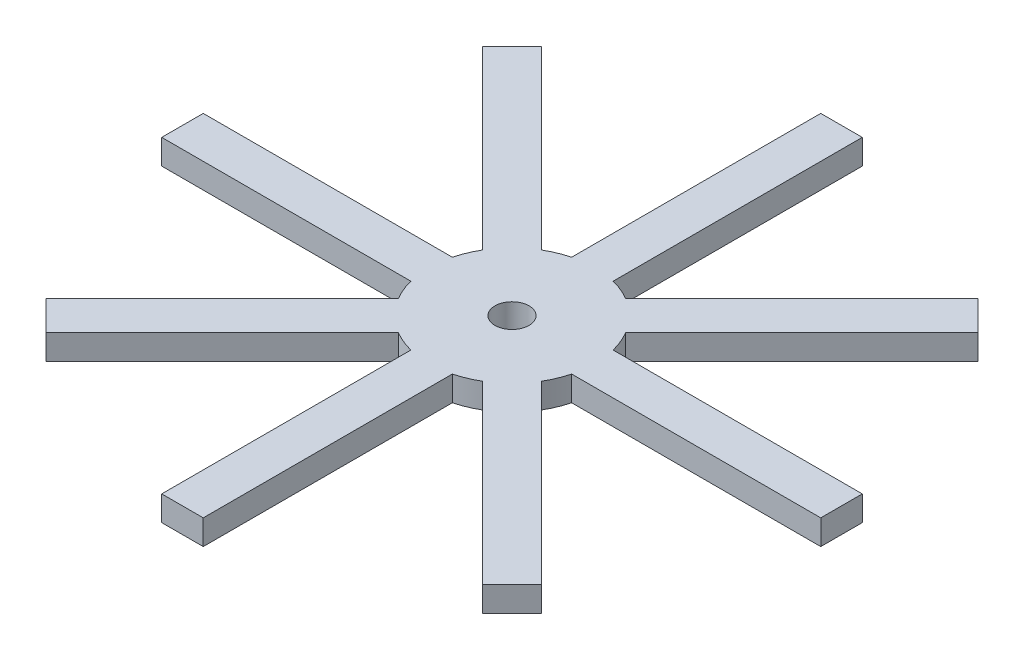
ISO-10303-21;
HEADER;
FILE_DESCRIPTION(('STEP AP214'),'2;1');
FILE_NAME('part.step','',(''),(''),'','','');
FILE_SCHEMA(('AUTOMOTIVE_DESIGN { 1 0 10303 214 1 1 1 1 }'));
ENDSEC;
DATA;
#1=APPLICATION_CONTEXT('core data for automotive mechanical design processes');
#2=APPLICATION_PROTOCOL_DEFINITION('international standard','automotive_design',2000,#1);
#3=PRODUCT_CONTEXT('',#1,'mechanical');
#4=PRODUCT('Part','Part','',(#3));
#5=PRODUCT_RELATED_PRODUCT_CATEGORY('part','',(#4));
#6=PRODUCT_DEFINITION_FORMATION('','',#4);
#7=PRODUCT_DEFINITION_CONTEXT('part definition',#1,'design');
#8=PRODUCT_DEFINITION('design','',#6,#7);
#9=PRODUCT_DEFINITION_SHAPE('','',#8);
#10=(LENGTH_UNIT() NAMED_UNIT(*) SI_UNIT(.MILLI.,.METRE.));
#11=(NAMED_UNIT(*) PLANE_ANGLE_UNIT() SI_UNIT($,.RADIAN.));
#12=(NAMED_UNIT(*) SI_UNIT($,.STERADIAN.) SOLID_ANGLE_UNIT());
#13=UNCERTAINTY_MEASURE_WITH_UNIT(LENGTH_MEASURE(1.E-05),#10,'distance_accuracy_value','');
#14=(GEOMETRIC_REPRESENTATION_CONTEXT(3) GLOBAL_UNCERTAINTY_ASSIGNED_CONTEXT((#13)) GLOBAL_UNIT_ASSIGNED_CONTEXT((#10,
#11,#12)) REPRESENTATION_CONTEXT('',''));
#15=CARTESIAN_POINT('',(0.,0.,0.));
#16=DIRECTION('',(0.,0.,1.));
#17=DIRECTION('',(1.,0.,0.));
#18=AXIS2_PLACEMENT_3D('',#15,#16,#17);
#19=CARTESIAN_POINT('',(0.,6.,0.));
#20=DIRECTION('',(0.,-1.,0.));
#21=DIRECTION('',(0.,0.,-1.));
#22=AXIS2_PLACEMENT_3D('',#19,#20,#21);
#23=CYLINDRICAL_SURFACE('',#22,20.);
#24=CARTESIAN_POINT('',(0.,6.,0.));
#25=DIRECTION('',(0.,1.,0.));
#26=DIRECTION('',(0.,0.,1.));
#27=AXIS2_PLACEMENT_3D('',#24,#25,#26);
#28=CIRCLE('',#27,20.);
#29=CARTESIAN_POINT('',(-17.2285978435618,6.,-10.1575300316966));
#30=VERTEX_POINT('',#29);
#31=CARTESIAN_POINT('',(-19.364916731037,6.,-5.00000000000021));
#32=VERTEX_POINT('',#31);
#33=EDGE_CURVE('E43',#30,#32,#28,.T.);
#34=ORIENTED_EDGE('',*,*,#33,.F.);
#35=DIRECTION('',(0.,1.,0.));
#36=VECTOR('',#35,1.);
#37=CARTESIAN_POINT('',(-17.2285978435618,0.,-10.1575300316966));
#38=LINE('',#37,#36);
#39=CARTESIAN_POINT('',(-17.2285978435618,0.,-10.1575300316966));
#40=VERTEX_POINT('',#39);
#41=EDGE_CURVE('E248',#40,#30,#38,.T.);
#42=ORIENTED_EDGE('',*,*,#41,.F.);
#43=CARTESIAN_POINT('',(0.,0.,0.));
#44=DIRECTION('',(0.,1.,0.));
#45=DIRECTION('',(0.,0.,1.));
#46=AXIS2_PLACEMENT_3D('',#43,#44,#45);
#47=CIRCLE('',#46,20.);
#48=CARTESIAN_POINT('',(-19.364916731037,0.,-5.00000000000021));
#49=VERTEX_POINT('',#48);
#50=EDGE_CURVE('E260',#40,#49,#47,.T.);
#51=ORIENTED_EDGE('',*,*,#50,.T.);
#52=DIRECTION('',(0.,1.,0.));
#53=VECTOR('',#52,1.);
#54=CARTESIAN_POINT('',(-19.364916731037,0.,-5.00000000000021));
#55=LINE('',#54,#53);
#56=EDGE_CURVE('E470',#49,#32,#55,.T.);
#57=ORIENTED_EDGE('',*,*,#56,.T.);
#58=EDGE_LOOP('',(#34,#42,#51,#57));
#59=FACE_BOUND('',#58,.T.);
#60=ADVANCED_FACE('F34',(#59),#23,.T.);
#61=CARTESIAN_POINT('',(-19.3649167310371,6.,4.9999999999998));
#62=VERTEX_POINT('',#61);
#63=CARTESIAN_POINT('',(-17.228597843562,6.,10.1575300316963));
#64=VERTEX_POINT('',#63);
#65=EDGE_CURVE('E585',#62,#64,#28,.T.);
#66=ORIENTED_EDGE('',*,*,#65,.F.);
#67=DIRECTION('',(0.,1.,0.));
#68=VECTOR('',#67,1.);
#69=CARTESIAN_POINT('',(-19.3649167310371,0.,4.9999999999998));
#70=LINE('',#69,#68);
#71=CARTESIAN_POINT('',(-19.3649167310371,0.,4.9999999999998));
#72=VERTEX_POINT('',#71);
#73=EDGE_CURVE('E468',#72,#62,#70,.T.);
#74=ORIENTED_EDGE('',*,*,#73,.F.);
#75=CARTESIAN_POINT('',(-17.228597843562,0.,10.1575300316963));
#76=VERTEX_POINT('',#75);
#77=EDGE_CURVE('E271',#72,#76,#47,.T.);
#78=ORIENTED_EDGE('',*,*,#77,.T.);
#79=DIRECTION('',(0.,1.,0.));
#80=VECTOR('',#79,1.);
#81=CARTESIAN_POINT('',(-17.228597843562,0.,10.1575300316963));
#82=LINE('',#81,#80);
#83=EDGE_CURVE('E446',#76,#64,#82,.T.);
#84=ORIENTED_EDGE('',*,*,#83,.T.);
#85=EDGE_LOOP('',(#66,#74,#78,#84));
#86=FACE_BOUND('',#85,.T.);
#87=ADVANCED_FACE('F608',(#86),#23,.T.);
#88=CARTESIAN_POINT('',(-10.1575300316966,6.,17.2285978435618));
#89=VERTEX_POINT('',#88);
#90=CARTESIAN_POINT('',(-5.00000000000014,6.,19.364916731037));
#91=VERTEX_POINT('',#90);
#92=EDGE_CURVE('E586',#89,#91,#28,.T.);
#93=ORIENTED_EDGE('',*,*,#92,.F.);
#94=DIRECTION('',(0.,1.,0.));
#95=VECTOR('',#94,1.);
#96=CARTESIAN_POINT('',(-10.1575300316966,0.,17.2285978435618));
#97=LINE('',#96,#95);
#98=CARTESIAN_POINT('',(-10.1575300316966,0.,17.2285978435618));
#99=VERTEX_POINT('',#98);
#100=EDGE_CURVE('E443',#99,#89,#97,.T.);
#101=ORIENTED_EDGE('',*,*,#100,.F.);
#102=CARTESIAN_POINT('',(-5.00000000000014,0.,19.364916731037));
#103=VERTEX_POINT('',#102);
#104=EDGE_CURVE('E274',#99,#103,#47,.T.);
#105=ORIENTED_EDGE('',*,*,#104,.T.);
#106=DIRECTION('',(0.,1.,0.));
#107=VECTOR('',#106,1.);
#108=CARTESIAN_POINT('',(-5.00000000000014,0.,19.364916731037));
#109=LINE('',#108,#107);
#110=EDGE_CURVE('E421',#103,#91,#109,.T.);
#111=ORIENTED_EDGE('',*,*,#110,.T.);
#112=EDGE_LOOP('',(#93,#101,#105,#111));
#113=FACE_BOUND('',#112,.T.);
#114=ADVANCED_FACE('F612',(#113),#23,.T.);
#115=CARTESIAN_POINT('',(4.99999999999987,6.,19.3649167310371));
#116=VERTEX_POINT('',#115);
#117=CARTESIAN_POINT('',(10.1575300316963,6.,17.2285978435619));
#118=VERTEX_POINT('',#117);
#119=EDGE_CURVE('E588',#116,#118,#28,.T.);
#120=ORIENTED_EDGE('',*,*,#119,.F.);
#121=DIRECTION('',(0.,1.,0.));
#122=VECTOR('',#121,1.);
#123=CARTESIAN_POINT('',(4.99999999999987,0.,19.3649167310371));
#124=LINE('',#123,#122);
#125=CARTESIAN_POINT('',(4.99999999999987,0.,19.3649167310371));
#126=VERTEX_POINT('',#125);
#127=EDGE_CURVE('E418',#126,#116,#124,.T.);
#128=ORIENTED_EDGE('',*,*,#127,.F.);
#129=CARTESIAN_POINT('',(10.1575300316963,0.,17.2285978435619));
#130=VERTEX_POINT('',#129);
#131=EDGE_CURVE('E280',#126,#130,#47,.T.);
#132=ORIENTED_EDGE('',*,*,#131,.T.);
#133=DIRECTION('',(0.,1.,0.));
#134=VECTOR('',#133,1.);
#135=CARTESIAN_POINT('',(10.1575300316963,0.,17.2285978435619));
#136=LINE('',#135,#134);
#137=EDGE_CURVE('E396',#130,#118,#136,.T.);
#138=ORIENTED_EDGE('',*,*,#137,.T.);
#139=EDGE_LOOP('',(#120,#128,#132,#138));
#140=FACE_BOUND('',#139,.T.);
#141=ADVANCED_FACE('F616',(#140),#23,.T.);
#142=CARTESIAN_POINT('',(17.2285978435619,6.,10.1575300316965));
#143=VERTEX_POINT('',#142);
#144=CARTESIAN_POINT('',(19.3649167310371,6.,5.00000000000008));
#145=VERTEX_POINT('',#144);
#146=EDGE_CURVE('E590',#143,#145,#28,.T.);
#147=ORIENTED_EDGE('',*,*,#146,.F.);
#148=DIRECTION('',(0.,1.,0.));
#149=VECTOR('',#148,1.);
#150=CARTESIAN_POINT('',(17.2285978435618,0.,10.1575300316965));
#151=LINE('',#150,#149);
#152=CARTESIAN_POINT('',(17.2285978435618,0.,10.1575300316965));
#153=VERTEX_POINT('',#152);
#154=EDGE_CURVE('E393',#153,#143,#151,.T.);
#155=ORIENTED_EDGE('',*,*,#154,.F.);
#156=CARTESIAN_POINT('',(19.3649167310371,0.,5.00000000000008));
#157=VERTEX_POINT('',#156);
#158=EDGE_CURVE('E286',#153,#157,#47,.T.);
#159=ORIENTED_EDGE('',*,*,#158,.T.);
#160=DIRECTION('',(0.,1.,0.));
#161=VECTOR('',#160,1.);
#162=CARTESIAN_POINT('',(19.3649167310371,0.,5.00000000000008));
#163=LINE('',#162,#161);
#164=EDGE_CURVE('E371',#157,#145,#163,.T.);
#165=ORIENTED_EDGE('',*,*,#164,.T.);
#166=EDGE_LOOP('',(#147,#155,#159,#165));
#167=FACE_BOUND('',#166,.T.);
#168=ADVANCED_FACE('F604',(#167),#23,.T.);
#169=CARTESIAN_POINT('',(19.3649167310371,6.,-4.99999999999993));
#170=VERTEX_POINT('',#169);
#171=CARTESIAN_POINT('',(17.2285978435619,6.,-10.1575300316964));
#172=VERTEX_POINT('',#171);
#173=EDGE_CURVE('E592',#170,#172,#28,.T.);
#174=ORIENTED_EDGE('',*,*,#173,.F.);
#175=DIRECTION('',(0.,1.,0.));
#176=VECTOR('',#175,1.);
#177=CARTESIAN_POINT('',(19.3649167310371,0.,-4.99999999999994));
#178=LINE('',#177,#176);
#179=CARTESIAN_POINT('',(19.3649167310371,0.,-4.99999999999994));
#180=VERTEX_POINT('',#179);
#181=EDGE_CURVE('E368',#180,#170,#178,.T.);
#182=ORIENTED_EDGE('',*,*,#181,.F.);
#183=CARTESIAN_POINT('',(17.2285978435619,0.,-10.1575300316964));
#184=VERTEX_POINT('',#183);
#185=EDGE_CURVE('E292',#180,#184,#47,.T.);
#186=ORIENTED_EDGE('',*,*,#185,.T.);
#187=DIRECTION('',(0.,1.,0.));
#188=VECTOR('',#187,1.);
#189=CARTESIAN_POINT('',(17.2285978435619,0.,-10.1575300316964));
#190=LINE('',#189,#188);
#191=EDGE_CURVE('E346',#184,#172,#190,.T.);
#192=ORIENTED_EDGE('',*,*,#191,.T.);
#193=EDGE_LOOP('',(#174,#182,#186,#192));
#194=FACE_BOUND('',#193,.T.);
#195=ADVANCED_FACE('F598',(#194),#23,.T.);
#196=CARTESIAN_POINT('',(10.1575300316965,6.,-17.2285978435619));
#197=VERTEX_POINT('',#196);
#198=CARTESIAN_POINT('',(5.00000000000001,6.,-19.3649167310371));
#199=VERTEX_POINT('',#198);
#200=EDGE_CURVE('E44',#197,#199,#28,.T.);
#201=ORIENTED_EDGE('',*,*,#200,.F.);
#202=DIRECTION('',(0.,1.,0.));
#203=VECTOR('',#202,1.);
#204=CARTESIAN_POINT('',(10.1575300316964,0.,-17.2285978435619));
#205=LINE('',#204,#203);
#206=CARTESIAN_POINT('',(10.1575300316964,0.,-17.2285978435619));
#207=VERTEX_POINT('',#206);
#208=EDGE_CURVE('E343',#207,#197,#205,.T.);
#209=ORIENTED_EDGE('',*,*,#208,.F.);
#210=CARTESIAN_POINT('',(5.00000000000001,0.,-19.3649167310371));
#211=VERTEX_POINT('',#210);
#212=EDGE_CURVE('E273',#207,#211,#47,.T.);
#213=ORIENTED_EDGE('',*,*,#212,.T.);
#214=DIRECTION('',(0.,1.,0.));
#215=VECTOR('',#214,1.);
#216=CARTESIAN_POINT('',(5.00000000000001,0.,-19.3649167310371));
#217=LINE('',#216,#215);
#218=EDGE_CURVE('E321',#211,#199,#217,.T.);
#219=ORIENTED_EDGE('',*,*,#218,.T.);
#220=EDGE_LOOP('',(#201,#209,#213,#219));
#221=FACE_BOUND('',#220,.T.);
#222=ADVANCED_FACE('F596',(#221),#23,.T.);
#223=CARTESIAN_POINT('',(0.,6.,0.));
#224=DIRECTION('',(0.,1.,0.));
#225=DIRECTION('',(0.,0.,1.));
#226=AXIS2_PLACEMENT_3D('',#223,#224,#225);
#227=PLANE('',#226);
#228=CARTESIAN_POINT('',(-5.,6.,-19.3649167310371));
#229=VERTEX_POINT('',#228);
#230=CARTESIAN_POINT('',(-10.1575300316962,6.,-17.228597843562));
#231=VERTEX_POINT('',#230);
#232=EDGE_CURVE('E11',#229,#231,#28,.T.);
#233=ORIENTED_EDGE('',*,*,#232,.T.);
#234=DIRECTION('',(-0.707106781186539,0.,-0.707106781186556));
#235=VECTOR('',#234,1.);
#236=CARTESIAN_POINT('',(-52.5839369028885,6.,-59.6550047147554));
#237=LINE('',#236,#235);
#238=CARTESIAN_POINT('',(-52.5839369028885,6.,-59.6550047147554));
#239=VERTEX_POINT('',#238);
#240=EDGE_CURVE('E493',#231,#239,#237,.T.);
#241=ORIENTED_EDGE('',*,*,#240,.T.);
#242=DIRECTION('',(-0.707106781186556,0.,0.707106781186539));
#243=VECTOR('',#242,1.);
#244=CARTESIAN_POINT('',(-59.6550047147541,6.,-52.58393690289));
#245=LINE('',#244,#243);
#246=CARTESIAN_POINT('',(-59.6550047147541,6.,-52.58393690289));
#247=VERTEX_POINT('',#246);
#248=EDGE_CURVE('E256',#239,#247,#245,.T.);
#249=ORIENTED_EDGE('',*,*,#248,.T.);
#250=DIRECTION('',(0.707106781186539,0.,0.707106781186556));
#251=VECTOR('',#250,1.);
#252=CARTESIAN_POINT('',(-59.6550047147541,6.,-52.58393690289));
#253=LINE('',#252,#251);
#254=EDGE_CURVE('E51',#247,#30,#253,.T.);
#255=ORIENTED_EDGE('',*,*,#254,.T.);
#256=ORIENTED_EDGE('',*,*,#33,.T.);
#257=DIRECTION('',(-1.,0.,0.));
#258=VECTOR('',#257,1.);
#259=CARTESIAN_POINT('',(-79.364916731037,6.,-5.00000000000083));
#260=LINE('',#259,#258);
#261=CARTESIAN_POINT('',(-79.364916731037,6.,-5.00000000000083));
#262=VERTEX_POINT('',#261);
#263=EDGE_CURVE('E479',#32,#262,#260,.T.);
#264=ORIENTED_EDGE('',*,*,#263,.T.);
#265=DIRECTION('',(0.,0.,1.));
#266=VECTOR('',#265,1.);
#267=CARTESIAN_POINT('',(-79.3649167310371,6.,4.99999999999917));
#268=LINE('',#267,#266);
#269=CARTESIAN_POINT('',(-79.3649167310371,6.,4.99999999999917));
#270=VERTEX_POINT('',#269);
#271=EDGE_CURVE('E476',#262,#270,#268,.T.);
#272=ORIENTED_EDGE('',*,*,#271,.T.);
#273=DIRECTION('',(1.,0.,0.));
#274=VECTOR('',#273,1.);
#275=CARTESIAN_POINT('',(-79.3649167310371,6.,4.99999999999917));
#276=LINE('',#275,#274);
#277=EDGE_CURVE('E58',#270,#62,#276,.T.);
#278=ORIENTED_EDGE('',*,*,#277,.T.);
#279=ORIENTED_EDGE('',*,*,#65,.T.);
#280=DIRECTION('',(-0.707106781186554,0.,0.707106781186541));
#281=VECTOR('',#280,1.);
#282=CARTESIAN_POINT('',(-59.6550047147552,6.,52.5839369028887));
#283=LINE('',#282,#281);
#284=CARTESIAN_POINT('',(-59.6550047147552,6.,52.5839369028887));
#285=VERTEX_POINT('',#284);
#286=EDGE_CURVE('E456',#64,#285,#283,.T.);
#287=ORIENTED_EDGE('',*,*,#286,.T.);
#288=DIRECTION('',(0.707106781186541,0.,0.707106781186554));
#289=VECTOR('',#288,1.);
#290=CARTESIAN_POINT('',(-52.5839369028898,6.,59.6550047147543));
#291=LINE('',#290,#289);
#292=CARTESIAN_POINT('',(-52.5839369028898,6.,59.6550047147543));
#293=VERTEX_POINT('',#292);
#294=EDGE_CURVE('E452',#285,#293,#291,.T.);
#295=ORIENTED_EDGE('',*,*,#294,.T.);
#296=DIRECTION('',(0.707106781186554,0.,-0.707106781186541));
#297=VECTOR('',#296,1.);
#298=CARTESIAN_POINT('',(-52.5839369028898,6.,59.6550047147543));
#299=LINE('',#298,#297);
#300=EDGE_CURVE('E459',#293,#89,#299,.T.);
#301=ORIENTED_EDGE('',*,*,#300,.T.);
#302=ORIENTED_EDGE('',*,*,#92,.T.);
#303=DIRECTION('',(0.,0.,1.));
#304=VECTOR('',#303,1.);
#305=CARTESIAN_POINT('',(-5.00000000000055,6.,79.364916731037));
#306=LINE('',#305,#304);
#307=CARTESIAN_POINT('',(-5.00000000000055,6.,79.364916731037));
#308=VERTEX_POINT('',#307);
#309=EDGE_CURVE('E431',#91,#308,#306,.T.);
#310=ORIENTED_EDGE('',*,*,#309,.T.);
#311=DIRECTION('',(1.,0.,0.));
#312=VECTOR('',#311,1.);
#313=CARTESIAN_POINT('',(4.99999999999945,6.,79.3649167310371));
#314=LINE('',#313,#312);
#315=CARTESIAN_POINT('',(4.99999999999945,6.,79.3649167310371));
#316=VERTEX_POINT('',#315);
#317=EDGE_CURVE('E427',#308,#316,#314,.T.);
#318=ORIENTED_EDGE('',*,*,#317,.T.);
#319=DIRECTION('',(0.,0.,-1.));
#320=VECTOR('',#319,1.);
#321=CARTESIAN_POINT('',(4.99999999999945,6.,79.3649167310371));
#322=LINE('',#321,#320);
#323=EDGE_CURVE('E434',#316,#116,#322,.T.);
#324=ORIENTED_EDGE('',*,*,#323,.T.);
#325=ORIENTED_EDGE('',*,*,#119,.T.);
#326=DIRECTION('',(0.707106781186544,0.,0.707106781186551));
#327=VECTOR('',#326,1.);
#328=CARTESIAN_POINT('',(52.5839369028889,6.,59.655004714755));
#329=LINE('',#328,#327);
#330=CARTESIAN_POINT('',(52.5839369028889,6.,59.655004714755));
#331=VERTEX_POINT('',#330);
#332=EDGE_CURVE('E406',#118,#331,#329,.T.);
#333=ORIENTED_EDGE('',*,*,#332,.T.);
#334=DIRECTION('',(0.707106781186552,0.,-0.707106781186543));
#335=VECTOR('',#334,1.);
#336=CARTESIAN_POINT('',(59.6550047147545,6.,52.5839369028896));
#337=LINE('',#336,#335);
#338=CARTESIAN_POINT('',(59.6550047147545,6.,52.5839369028896));
#339=VERTEX_POINT('',#338);
#340=EDGE_CURVE('E402',#331,#339,#337,.T.);
#341=ORIENTED_EDGE('',*,*,#340,.T.);
#342=DIRECTION('',(-0.707106781186544,0.,-0.707106781186551));
#343=VECTOR('',#342,1.);
#344=CARTESIAN_POINT('',(59.6550047147545,6.,52.5839369028896));
#345=LINE('',#344,#343);
#346=EDGE_CURVE('E409',#339,#143,#345,.T.);
#347=ORIENTED_EDGE('',*,*,#346,.T.);
#348=ORIENTED_EDGE('',*,*,#146,.T.);
#349=DIRECTION('',(1.,0.,0.));
#350=VECTOR('',#349,1.);
#351=CARTESIAN_POINT('',(79.3649167310371,6.,5.00000000000028));
#352=LINE('',#351,#350);
#353=CARTESIAN_POINT('',(79.3649167310371,6.,5.00000000000028));
#354=VERTEX_POINT('',#353);
#355=EDGE_CURVE('E381',#145,#354,#352,.T.);
#356=ORIENTED_EDGE('',*,*,#355,.T.);
#357=DIRECTION('',(0.,0.,-1.));
#358=VECTOR('',#357,1.);
#359=CARTESIAN_POINT('',(79.3649167310371,6.,-4.99999999999972));
#360=LINE('',#359,#358);
#361=CARTESIAN_POINT('',(79.3649167310371,6.,-4.99999999999972));
#362=VERTEX_POINT('',#361);
#363=EDGE_CURVE('E377',#354,#362,#360,.T.);
#364=ORIENTED_EDGE('',*,*,#363,.T.);
#365=DIRECTION('',(-1.,0.,0.));
#366=VECTOR('',#365,1.);
#367=CARTESIAN_POINT('',(79.3649167310371,6.,-4.99999999999972));
#368=LINE('',#367,#366);
#369=EDGE_CURVE('E384',#362,#170,#368,.T.);
#370=ORIENTED_EDGE('',*,*,#369,.T.);
#371=ORIENTED_EDGE('',*,*,#173,.T.);
#372=DIRECTION('',(0.707106781186549,0.,-0.707106781186546));
#373=VECTOR('',#372,1.);
#374=CARTESIAN_POINT('',(59.6550047147548,6.,-52.5839369028892));
#375=LINE('',#374,#373);
#376=CARTESIAN_POINT('',(59.6550047147548,6.,-52.5839369028892));
#377=VERTEX_POINT('',#376);
#378=EDGE_CURVE('E356',#172,#377,#375,.T.);
#379=ORIENTED_EDGE('',*,*,#378,.T.);
#380=DIRECTION('',(-0.707106781186546,0.,-0.707106781186549));
#381=VECTOR('',#380,1.);
#382=CARTESIAN_POINT('',(52.5839369028894,6.,-59.6550047147546));
#383=LINE('',#382,#381);
#384=CARTESIAN_POINT('',(52.5839369028894,6.,-59.6550047147546));
#385=VERTEX_POINT('',#384);
#386=EDGE_CURVE('E352',#377,#385,#383,.T.);
#387=ORIENTED_EDGE('',*,*,#386,.T.);
#388=DIRECTION('',(-0.707106781186549,0.,0.707106781186546));
#389=VECTOR('',#388,1.);
#390=CARTESIAN_POINT('',(52.5839369028894,6.,-59.6550047147546));
#391=LINE('',#390,#389);
#392=EDGE_CURVE('E359',#385,#197,#391,.T.);
#393=ORIENTED_EDGE('',*,*,#392,.T.);
#394=ORIENTED_EDGE('',*,*,#200,.T.);
#395=DIRECTION('',(0.,0.,-1.));
#396=VECTOR('',#395,1.);
#397=CARTESIAN_POINT('',(5.,6.,-79.3649167310371));
#398=LINE('',#397,#396);
#399=CARTESIAN_POINT('',(5.,6.,-79.3649167310371));
#400=VERTEX_POINT('',#399);
#401=EDGE_CURVE('E331',#199,#400,#398,.T.);
#402=ORIENTED_EDGE('',*,*,#401,.T.);
#403=DIRECTION('',(-1.,0.,0.));
#404=VECTOR('',#403,1.);
#405=CARTESIAN_POINT('',(-5.,6.,-79.3649167310371));
#406=LINE('',#405,#404);
#407=CARTESIAN_POINT('',(-5.,6.,-79.3649167310371));
#408=VERTEX_POINT('',#407);
#409=EDGE_CURVE('E327',#400,#408,#406,.T.);
#410=ORIENTED_EDGE('',*,*,#409,.T.);
#411=DIRECTION('',(0.,0.,1.));
#412=VECTOR('',#411,1.);
#413=CARTESIAN_POINT('',(-5.,6.,-79.3649167310371));
#414=LINE('',#413,#412);
#415=EDGE_CURVE('E334',#408,#229,#414,.T.);
#416=ORIENTED_EDGE('',*,*,#415,.T.);
#417=EDGE_LOOP('',(#233,#241,#249,#255,#256,#264,#272,#278,#279,#287,#295,#301,#302,#310,#318,
#324,#325,#333,#341,#347,#348,#356,#364,#370,#371,#379,#387,#393,#394,#402,#410,#416));
#418=FACE_BOUND('',#417,.T.);
#419=CARTESIAN_POINT('',(0.,6.,0.));
#420=DIRECTION('',(0.,1.,0.));
#421=DIRECTION('',(0.,0.,1.));
#422=AXIS2_PLACEMENT_3D('',#419,#420,#421);
#423=CIRCLE('',#422,4.1);
#424=CARTESIAN_POINT('',(0.,6.,4.1));
#425=VERTEX_POINT('',#424);
#426=EDGE_CURVE('E303',#425,#425,#423,.T.);
#427=ORIENTED_EDGE('',*,*,#426,.F.);
#428=EDGE_LOOP('',(#427));
#429=FACE_BOUND('',#428,.T.);
#430=ADVANCED_FACE('F506',(#418,#429),#227,.T.);
#431=CARTESIAN_POINT('',(0.,0.,0.));
#432=DIRECTION('',(0.,1.,0.));
#433=DIRECTION('',(0.,0.,1.));
#434=AXIS2_PLACEMENT_3D('',#431,#432,#433);
#435=PLANE('',#434);
#436=ORIENTED_EDGE('',*,*,#50,.F.);
#437=DIRECTION('',(0.707106781186539,0.,0.707106781186556));
#438=VECTOR('',#437,1.);
#439=CARTESIAN_POINT('',(-59.6550047147541,0.,-52.58393690289));
#440=LINE('',#439,#438);
#441=CARTESIAN_POINT('',(-59.6550047147541,0.,-52.58393690289));
#442=VERTEX_POINT('',#441);
#443=EDGE_CURVE('E245',#442,#40,#440,.T.);
#444=ORIENTED_EDGE('',*,*,#443,.F.);
#445=DIRECTION('',(-0.707106781186556,0.,0.707106781186539));
#446=VECTOR('',#445,1.);
#447=CARTESIAN_POINT('',(-59.6550047147541,0.,-52.58393690289));
#448=LINE('',#447,#446);
#449=CARTESIAN_POINT('',(-52.5839369028885,0.,-59.6550047147554));
#450=VERTEX_POINT('',#449);
#451=EDGE_CURVE('E263',#450,#442,#448,.T.);
#452=ORIENTED_EDGE('',*,*,#451,.F.);
#453=DIRECTION('',(-0.707106781186539,0.,-0.707106781186556));
#454=VECTOR('',#453,1.);
#455=CARTESIAN_POINT('',(-52.5839369028885,0.,-59.6550047147554));
#456=LINE('',#455,#454);
#457=CARTESIAN_POINT('',(-10.1575300316962,0.,-17.228597843562));
#458=VERTEX_POINT('',#457);
#459=EDGE_CURVE('E255',#458,#450,#456,.T.);
#460=ORIENTED_EDGE('',*,*,#459,.F.);
#461=CARTESIAN_POINT('',(-5.00000000000001,0.,-19.3649167310371));
#462=VERTEX_POINT('',#461);
#463=EDGE_CURVE('E38',#462,#458,#47,.T.);
#464=ORIENTED_EDGE('',*,*,#463,.F.);
#465=DIRECTION('',(0.,0.,1.));
#466=VECTOR('',#465,1.);
#467=CARTESIAN_POINT('',(-5.,0.,-79.3649167310371));
#468=LINE('',#467,#466);
#469=CARTESIAN_POINT('',(-5.,0.,-79.3649167310371));
#470=VERTEX_POINT('',#469);
#471=EDGE_CURVE('E330',#470,#462,#468,.T.);
#472=ORIENTED_EDGE('',*,*,#471,.F.);
#473=DIRECTION('',(-1.,0.,0.));
#474=VECTOR('',#473,1.);
#475=CARTESIAN_POINT('',(-5.,0.,-79.3649167310371));
#476=LINE('',#475,#474);
#477=CARTESIAN_POINT('',(5.,0.,-79.3649167310371));
#478=VERTEX_POINT('',#477);
#479=EDGE_CURVE('E322',#478,#470,#476,.T.);
#480=ORIENTED_EDGE('',*,*,#479,.F.);
#481=DIRECTION('',(0.,0.,-1.));
#482=VECTOR('',#481,1.);
#483=CARTESIAN_POINT('',(5.,0.,-79.3649167310371));
#484=LINE('',#483,#482);
#485=EDGE_CURVE('E339',#211,#478,#484,.T.);
#486=ORIENTED_EDGE('',*,*,#485,.F.);
#487=ORIENTED_EDGE('',*,*,#212,.F.);
#488=DIRECTION('',(-0.707106781186549,0.,0.707106781186546));
#489=VECTOR('',#488,1.);
#490=CARTESIAN_POINT('',(52.5839369028894,0.,-59.6550047147546));
#491=LINE('',#490,#489);
#492=CARTESIAN_POINT('',(52.5839369028894,0.,-59.6550047147546));
#493=VERTEX_POINT('',#492);
#494=EDGE_CURVE('E355',#493,#207,#491,.T.);
#495=ORIENTED_EDGE('',*,*,#494,.F.);
#496=DIRECTION('',(-0.707106781186546,0.,-0.707106781186549));
#497=VECTOR('',#496,1.);
#498=CARTESIAN_POINT('',(52.5839369028894,0.,-59.6550047147546));
#499=LINE('',#498,#497);
#500=CARTESIAN_POINT('',(59.6550047147548,0.,-52.5839369028892));
#501=VERTEX_POINT('',#500);
#502=EDGE_CURVE('E347',#501,#493,#499,.T.);
#503=ORIENTED_EDGE('',*,*,#502,.F.);
#504=DIRECTION('',(0.707106781186549,0.,-0.707106781186546));
#505=VECTOR('',#504,1.);
#506=CARTESIAN_POINT('',(59.6550047147548,0.,-52.5839369028892));
#507=LINE('',#506,#505);
#508=EDGE_CURVE('E364',#184,#501,#507,.T.);
#509=ORIENTED_EDGE('',*,*,#508,.F.);
#510=ORIENTED_EDGE('',*,*,#185,.F.);
#511=DIRECTION('',(-1.,0.,0.));
#512=VECTOR('',#511,1.);
#513=CARTESIAN_POINT('',(79.3649167310371,0.,-4.99999999999972));
#514=LINE('',#513,#512);
#515=CARTESIAN_POINT('',(79.3649167310371,0.,-4.99999999999972));
#516=VERTEX_POINT('',#515);
#517=EDGE_CURVE('E380',#516,#180,#514,.T.);
#518=ORIENTED_EDGE('',*,*,#517,.F.);
#519=DIRECTION('',(0.,0.,-1.));
#520=VECTOR('',#519,1.);
#521=CARTESIAN_POINT('',(79.3649167310371,0.,-4.99999999999972));
#522=LINE('',#521,#520);
#523=CARTESIAN_POINT('',(79.3649167310371,0.,5.00000000000028));
#524=VERTEX_POINT('',#523);
#525=EDGE_CURVE('E372',#524,#516,#522,.T.);
#526=ORIENTED_EDGE('',*,*,#525,.F.);
#527=DIRECTION('',(1.,0.,0.));
#528=VECTOR('',#527,1.);
#529=CARTESIAN_POINT('',(79.3649167310371,0.,5.00000000000028));
#530=LINE('',#529,#528);
#531=EDGE_CURVE('E389',#157,#524,#530,.T.);
#532=ORIENTED_EDGE('',*,*,#531,.F.);
#533=ORIENTED_EDGE('',*,*,#158,.F.);
#534=DIRECTION('',(-0.707106781186544,0.,-0.707106781186551));
#535=VECTOR('',#534,1.);
#536=CARTESIAN_POINT('',(59.6550047147545,0.,52.5839369028896));
#537=LINE('',#536,#535);
#538=CARTESIAN_POINT('',(59.6550047147545,0.,52.5839369028896));
#539=VERTEX_POINT('',#538);
#540=EDGE_CURVE('E405',#539,#153,#537,.T.);
#541=ORIENTED_EDGE('',*,*,#540,.F.);
#542=DIRECTION('',(0.707106781186552,0.,-0.707106781186543));
#543=VECTOR('',#542,1.);
#544=CARTESIAN_POINT('',(59.6550047147545,0.,52.5839369028896));
#545=LINE('',#544,#543);
#546=CARTESIAN_POINT('',(52.5839369028889,0.,59.655004714755));
#547=VERTEX_POINT('',#546);
#548=EDGE_CURVE('E397',#547,#539,#545,.T.);
#549=ORIENTED_EDGE('',*,*,#548,.F.);
#550=DIRECTION('',(0.707106781186544,0.,0.707106781186551));
#551=VECTOR('',#550,1.);
#552=CARTESIAN_POINT('',(52.5839369028889,0.,59.655004714755));
#553=LINE('',#552,#551);
#554=EDGE_CURVE('E414',#130,#547,#553,.T.);
#555=ORIENTED_EDGE('',*,*,#554,.F.);
#556=ORIENTED_EDGE('',*,*,#131,.F.);
#557=DIRECTION('',(0.,0.,-1.));
#558=VECTOR('',#557,1.);
#559=CARTESIAN_POINT('',(4.99999999999945,0.,79.3649167310371));
#560=LINE('',#559,#558);
#561=CARTESIAN_POINT('',(4.99999999999945,0.,79.3649167310371));
#562=VERTEX_POINT('',#561);
#563=EDGE_CURVE('E430',#562,#126,#560,.T.);
#564=ORIENTED_EDGE('',*,*,#563,.F.);
#565=DIRECTION('',(1.,0.,0.));
#566=VECTOR('',#565,1.);
#567=CARTESIAN_POINT('',(4.99999999999945,0.,79.3649167310371));
#568=LINE('',#567,#566);
#569=CARTESIAN_POINT('',(-5.00000000000055,0.,79.364916731037));
#570=VERTEX_POINT('',#569);
#571=EDGE_CURVE('E422',#570,#562,#568,.T.);
#572=ORIENTED_EDGE('',*,*,#571,.F.);
#573=DIRECTION('',(0.,0.,1.));
#574=VECTOR('',#573,1.);
#575=CARTESIAN_POINT('',(-5.00000000000055,0.,79.364916731037));
#576=LINE('',#575,#574);
#577=EDGE_CURVE('E439',#103,#570,#576,.T.);
#578=ORIENTED_EDGE('',*,*,#577,.F.);
#579=ORIENTED_EDGE('',*,*,#104,.F.);
#580=DIRECTION('',(0.707106781186554,0.,-0.707106781186541));
#581=VECTOR('',#580,1.);
#582=CARTESIAN_POINT('',(-52.5839369028898,0.,59.6550047147543));
#583=LINE('',#582,#581);
#584=CARTESIAN_POINT('',(-52.5839369028898,0.,59.6550047147543));
#585=VERTEX_POINT('',#584);
#586=EDGE_CURVE('E455',#585,#99,#583,.T.);
#587=ORIENTED_EDGE('',*,*,#586,.F.);
#588=DIRECTION('',(0.707106781186541,0.,0.707106781186554));
#589=VECTOR('',#588,1.);
#590=CARTESIAN_POINT('',(-52.5839369028898,0.,59.6550047147543));
#591=LINE('',#590,#589);
#592=CARTESIAN_POINT('',(-59.6550047147552,0.,52.5839369028887));
#593=VERTEX_POINT('',#592);
#594=EDGE_CURVE('E447',#593,#585,#591,.T.);
#595=ORIENTED_EDGE('',*,*,#594,.F.);
#596=DIRECTION('',(-0.707106781186554,0.,0.707106781186541));
#597=VECTOR('',#596,1.);
#598=CARTESIAN_POINT('',(-59.6550047147552,0.,52.5839369028887));
#599=LINE('',#598,#597);
#600=EDGE_CURVE('E464',#76,#593,#599,.T.);
#601=ORIENTED_EDGE('',*,*,#600,.F.);
#602=ORIENTED_EDGE('',*,*,#77,.F.);
#603=DIRECTION('',(1.,0.,0.));
#604=VECTOR('',#603,1.);
#605=CARTESIAN_POINT('',(-79.3649167310371,0.,4.99999999999917));
#606=LINE('',#605,#604);
#607=CARTESIAN_POINT('',(-79.3649167310371,0.,4.99999999999917));
#608=VERTEX_POINT('',#607);
#609=EDGE_CURVE('E478',#608,#72,#606,.T.);
#610=ORIENTED_EDGE('',*,*,#609,.F.);
#611=DIRECTION('',(0.,0.,1.));
#612=VECTOR('',#611,1.);
#613=CARTESIAN_POINT('',(-79.3649167310371,0.,4.99999999999917));
#614=LINE('',#613,#612);
#615=CARTESIAN_POINT('',(-79.364916731037,0.,-5.00000000000083));
#616=VERTEX_POINT('',#615);
#617=EDGE_CURVE('E471',#616,#608,#614,.T.);
#618=ORIENTED_EDGE('',*,*,#617,.F.);
#619=DIRECTION('',(-1.,0.,0.));
#620=VECTOR('',#619,1.);
#621=CARTESIAN_POINT('',(-79.364916731037,0.,-5.00000000000083));
#622=LINE('',#621,#620);
#623=EDGE_CURVE('E270',#49,#616,#622,.T.);
#624=ORIENTED_EDGE('',*,*,#623,.F.);
#625=EDGE_LOOP('',(#436,#444,#452,#460,#464,#472,#480,#486,#487,#495,#503,#509,#510,#518,#526,
#532,#533,#541,#549,#555,#556,#564,#572,#578,#579,#587,#595,#601,#602,#610,#618,#624));
#626=FACE_BOUND('',#625,.T.);
#627=CARTESIAN_POINT('',(0.,0.,0.));
#628=DIRECTION('',(0.,1.,0.));
#629=DIRECTION('',(0.,0.,1.));
#630=AXIS2_PLACEMENT_3D('',#627,#628,#629);
#631=CIRCLE('',#630,4.1);
#632=CARTESIAN_POINT('',(0.,0.,4.1));
#633=VERTEX_POINT('',#632);
#634=EDGE_CURVE('E310',#633,#633,#631,.T.);
#635=ORIENTED_EDGE('',*,*,#634,.T.);
#636=EDGE_LOOP('',(#635));
#637=FACE_BOUND('',#636,.T.);
#638=ADVANCED_FACE('F266',(#626,#637),#435,.F.);
#639=ORIENTED_EDGE('',*,*,#463,.T.);
#640=DIRECTION('',(0.,1.,0.));
#641=VECTOR('',#640,1.);
#642=CARTESIAN_POINT('',(-10.1575300316962,0.,-17.228597843562));
#643=LINE('',#642,#641);
#644=EDGE_CURVE('E262',#458,#231,#643,.T.);
#645=ORIENTED_EDGE('',*,*,#644,.T.);
#646=ORIENTED_EDGE('',*,*,#232,.F.);
#647=DIRECTION('',(0.,1.,0.));
#648=VECTOR('',#647,1.);
#649=CARTESIAN_POINT('',(-5.00000000000001,0.,-19.3649167310371));
#650=LINE('',#649,#648);
#651=EDGE_CURVE('E318',#462,#229,#650,.T.);
#652=ORIENTED_EDGE('',*,*,#651,.F.);
#653=EDGE_LOOP('',(#639,#645,#646,#652));
#654=FACE_BOUND('',#653,.T.);
#655=ADVANCED_FACE('F36',(#654),#23,.T.);
#656=CARTESIAN_POINT('',(0.,6.,0.));
#657=DIRECTION('',(0.,-1.,0.));
#658=DIRECTION('',(0.,0.,-1.));
#659=AXIS2_PLACEMENT_3D('',#656,#657,#658);
#660=CYLINDRICAL_SURFACE('',#659,4.1);
#661=ORIENTED_EDGE('',*,*,#426,.T.);
#662=EDGE_LOOP('',(#661));
#663=FACE_BOUND('',#662,.T.);
#664=ORIENTED_EDGE('',*,*,#634,.F.);
#665=EDGE_LOOP('',(#664));
#666=FACE_BOUND('',#665,.T.);
#667=ADVANCED_FACE('F606',(#663,#666),#660,.F.);
#668=CARTESIAN_POINT('',(-5.,0.,-79.3649167310371));
#669=DIRECTION('',(-1.,0.,0.));
#670=DIRECTION('',(0.,0.,1.));
#671=AXIS2_PLACEMENT_3D('',#668,#669,#670);
#672=PLANE('',#671);
#673=ORIENTED_EDGE('',*,*,#415,.F.);
#674=DIRECTION('',(0.,1.,0.));
#675=VECTOR('',#674,1.);
#676=CARTESIAN_POINT('',(-5.,0.,-79.3649167310371));
#677=LINE('',#676,#675);
#678=EDGE_CURVE('E315',#470,#408,#677,.T.);
#679=ORIENTED_EDGE('',*,*,#678,.F.);
#680=ORIENTED_EDGE('',*,*,#471,.T.);
#681=ORIENTED_EDGE('',*,*,#651,.T.);
#682=EDGE_LOOP('',(#673,#679,#680,#681));
#683=FACE_BOUND('',#682,.T.);
#684=ADVANCED_FACE('F663',(#683),#672,.T.);
#685=CARTESIAN_POINT('',(-5.,0.,-79.3649167310371));
#686=DIRECTION('',(0.,0.,-1.));
#687=DIRECTION('',(-1.,0.,0.));
#688=AXIS2_PLACEMENT_3D('',#685,#686,#687);
#689=PLANE('',#688);
#690=ORIENTED_EDGE('',*,*,#409,.F.);
#691=DIRECTION('',(0.,1.,0.));
#692=VECTOR('',#691,1.);
#693=CARTESIAN_POINT('',(5.,0.,-79.3649167310371));
#694=LINE('',#693,#692);
#695=EDGE_CURVE('E324',#478,#400,#694,.T.);
#696=ORIENTED_EDGE('',*,*,#695,.F.);
#697=ORIENTED_EDGE('',*,*,#479,.T.);
#698=ORIENTED_EDGE('',*,*,#678,.T.);
#699=EDGE_LOOP('',(#690,#696,#697,#698));
#700=FACE_BOUND('',#699,.T.);
#701=ADVANCED_FACE('F517',(#700),#689,.T.);
#702=CARTESIAN_POINT('',(5.,0.,-79.3649167310371));
#703=DIRECTION('',(1.,0.,0.));
#704=DIRECTION('',(0.,0.,-1.));
#705=AXIS2_PLACEMENT_3D('',#702,#703,#704);
#706=PLANE('',#705);
#707=ORIENTED_EDGE('',*,*,#401,.F.);
#708=ORIENTED_EDGE('',*,*,#218,.F.);
#709=ORIENTED_EDGE('',*,*,#485,.T.);
#710=ORIENTED_EDGE('',*,*,#695,.T.);
#711=EDGE_LOOP('',(#707,#708,#709,#710));
#712=FACE_BOUND('',#711,.T.);
#713=ADVANCED_FACE('F521',(#712),#706,.T.);
#714=CARTESIAN_POINT('',(52.5839369028894,0.,-59.6550047147546));
#715=DIRECTION('',(-0.707106781186546,0.,-0.707106781186549));
#716=DIRECTION('',(-0.707106781186549,0.,0.707106781186546));
#717=AXIS2_PLACEMENT_3D('',#714,#715,#716);
#718=PLANE('',#717);
#719=ORIENTED_EDGE('',*,*,#392,.F.);
#720=DIRECTION('',(0.,1.,0.));
#721=VECTOR('',#720,1.);
#722=CARTESIAN_POINT('',(52.5839369028894,0.,-59.6550047147546));
#723=LINE('',#722,#721);
#724=EDGE_CURVE('E336',#493,#385,#723,.T.);
#725=ORIENTED_EDGE('',*,*,#724,.F.);
#726=ORIENTED_EDGE('',*,*,#494,.T.);
#727=ORIENTED_EDGE('',*,*,#208,.T.);
#728=EDGE_LOOP('',(#719,#725,#726,#727));
#729=FACE_BOUND('',#728,.T.);
#730=ADVANCED_FACE('F656',(#729),#718,.T.);
#731=CARTESIAN_POINT('',(52.5839369028894,0.,-59.6550047147546));
#732=DIRECTION('',(0.707106781186549,0.,-0.707106781186546));
#733=DIRECTION('',(-0.707106781186546,0.,-0.707106781186549));
#734=AXIS2_PLACEMENT_3D('',#731,#732,#733);
#735=PLANE('',#734);
#736=ORIENTED_EDGE('',*,*,#386,.F.);
#737=DIRECTION('',(0.,1.,0.));
#738=VECTOR('',#737,1.);
#739=CARTESIAN_POINT('',(59.6550047147548,0.,-52.5839369028892));
#740=LINE('',#739,#738);
#741=EDGE_CURVE('E349',#501,#377,#740,.T.);
#742=ORIENTED_EDGE('',*,*,#741,.F.);
#743=ORIENTED_EDGE('',*,*,#502,.T.);
#744=ORIENTED_EDGE('',*,*,#724,.T.);
#745=EDGE_LOOP('',(#736,#742,#743,#744));
#746=FACE_BOUND('',#745,.T.);
#747=ADVANCED_FACE('F528',(#746),#735,.T.);
#748=CARTESIAN_POINT('',(59.6550047147548,0.,-52.5839369028892));
#749=DIRECTION('',(0.707106781186546,0.,0.707106781186549));
#750=DIRECTION('',(0.707106781186549,0.,-0.707106781186546));
#751=AXIS2_PLACEMENT_3D('',#748,#749,#750);
#752=PLANE('',#751);
#753=ORIENTED_EDGE('',*,*,#378,.F.);
#754=ORIENTED_EDGE('',*,*,#191,.F.);
#755=ORIENTED_EDGE('',*,*,#508,.T.);
#756=ORIENTED_EDGE('',*,*,#741,.T.);
#757=EDGE_LOOP('',(#753,#754,#755,#756));
#758=FACE_BOUND('',#757,.T.);
#759=ADVANCED_FACE('F532',(#758),#752,.T.);
#760=CARTESIAN_POINT('',(79.3649167310371,0.,-4.99999999999972));
#761=DIRECTION('',(0.,0.,-1.));
#762=DIRECTION('',(-1.,0.,0.));
#763=AXIS2_PLACEMENT_3D('',#760,#761,#762);
#764=PLANE('',#763);
#765=ORIENTED_EDGE('',*,*,#369,.F.);
#766=DIRECTION('',(0.,1.,0.));
#767=VECTOR('',#766,1.);
#768=CARTESIAN_POINT('',(79.3649167310371,0.,-4.99999999999972));
#769=LINE('',#768,#767);
#770=EDGE_CURVE('E361',#516,#362,#769,.T.);
#771=ORIENTED_EDGE('',*,*,#770,.F.);
#772=ORIENTED_EDGE('',*,*,#517,.T.);
#773=ORIENTED_EDGE('',*,*,#181,.T.);
#774=EDGE_LOOP('',(#765,#771,#772,#773));
#775=FACE_BOUND('',#774,.T.);
#776=ADVANCED_FACE('F649',(#775),#764,.T.);
#777=CARTESIAN_POINT('',(79.3649167310371,0.,-4.99999999999972));
#778=DIRECTION('',(1.,0.,0.));
#779=DIRECTION('',(0.,0.,-1.));
#780=AXIS2_PLACEMENT_3D('',#777,#778,#779);
#781=PLANE('',#780);
#782=ORIENTED_EDGE('',*,*,#363,.F.);
#783=DIRECTION('',(0.,1.,0.));
#784=VECTOR('',#783,1.);
#785=CARTESIAN_POINT('',(79.3649167310371,0.,5.00000000000028));
#786=LINE('',#785,#784);
#787=EDGE_CURVE('E374',#524,#354,#786,.T.);
#788=ORIENTED_EDGE('',*,*,#787,.F.);
#789=ORIENTED_EDGE('',*,*,#525,.T.);
#790=ORIENTED_EDGE('',*,*,#770,.T.);
#791=EDGE_LOOP('',(#782,#788,#789,#790));
#792=FACE_BOUND('',#791,.T.);
#793=ADVANCED_FACE('F539',(#792),#781,.T.);
#794=CARTESIAN_POINT('',(79.3649167310371,0.,5.00000000000028));
#795=DIRECTION('',(0.,0.,1.));
#796=DIRECTION('',(1.,0.,0.));
#797=AXIS2_PLACEMENT_3D('',#794,#795,#796);
#798=PLANE('',#797);
#799=ORIENTED_EDGE('',*,*,#355,.F.);
#800=ORIENTED_EDGE('',*,*,#164,.F.);
#801=ORIENTED_EDGE('',*,*,#531,.T.);
#802=ORIENTED_EDGE('',*,*,#787,.T.);
#803=EDGE_LOOP('',(#799,#800,#801,#802));
#804=FACE_BOUND('',#803,.T.);
#805=ADVANCED_FACE('F543',(#804),#798,.T.);
#806=CARTESIAN_POINT('',(59.6550047147545,0.,52.5839369028896));
#807=DIRECTION('',(0.707106781186551,0.,-0.707106781186544));
#808=DIRECTION('',(-0.707106781186544,0.,-0.707106781186551));
#809=AXIS2_PLACEMENT_3D('',#806,#807,#808);
#810=PLANE('',#809);
#811=ORIENTED_EDGE('',*,*,#346,.F.);
#812=DIRECTION('',(0.,1.,0.));
#813=VECTOR('',#812,1.);
#814=CARTESIAN_POINT('',(59.6550047147545,0.,52.5839369028896));
#815=LINE('',#814,#813);
#816=EDGE_CURVE('E386',#539,#339,#815,.T.);
#817=ORIENTED_EDGE('',*,*,#816,.F.);
#818=ORIENTED_EDGE('',*,*,#540,.T.);
#819=ORIENTED_EDGE('',*,*,#154,.T.);
#820=EDGE_LOOP('',(#811,#817,#818,#819));
#821=FACE_BOUND('',#820,.T.);
#822=ADVANCED_FACE('F642',(#821),#810,.T.);
#823=CARTESIAN_POINT('',(59.6550047147545,0.,52.5839369028896));
#824=DIRECTION('',(0.707106781186543,0.,0.707106781186552));
#825=DIRECTION('',(0.707106781186552,0.,-0.707106781186543));
#826=AXIS2_PLACEMENT_3D('',#823,#824,#825);
#827=PLANE('',#826);
#828=ORIENTED_EDGE('',*,*,#340,.F.);
#829=DIRECTION('',(0.,1.,0.));
#830=VECTOR('',#829,1.);
#831=CARTESIAN_POINT('',(52.5839369028889,0.,59.655004714755));
#832=LINE('',#831,#830);
#833=EDGE_CURVE('E399',#547,#331,#832,.T.);
#834=ORIENTED_EDGE('',*,*,#833,.F.);
#835=ORIENTED_EDGE('',*,*,#548,.T.);
#836=ORIENTED_EDGE('',*,*,#816,.T.);
#837=EDGE_LOOP('',(#828,#834,#835,#836));
#838=FACE_BOUND('',#837,.T.);
#839=ADVANCED_FACE('F550',(#838),#827,.T.);
#840=CARTESIAN_POINT('',(52.5839369028889,0.,59.655004714755));
#841=DIRECTION('',(-0.707106781186551,0.,0.707106781186544));
#842=DIRECTION('',(0.707106781186544,0.,0.707106781186551));
#843=AXIS2_PLACEMENT_3D('',#840,#841,#842);
#844=PLANE('',#843);
#845=ORIENTED_EDGE('',*,*,#332,.F.);
#846=ORIENTED_EDGE('',*,*,#137,.F.);
#847=ORIENTED_EDGE('',*,*,#554,.T.);
#848=ORIENTED_EDGE('',*,*,#833,.T.);
#849=EDGE_LOOP('',(#845,#846,#847,#848));
#850=FACE_BOUND('',#849,.T.);
#851=ADVANCED_FACE('F554',(#850),#844,.T.);
#852=CARTESIAN_POINT('',(4.99999999999945,0.,79.3649167310371));
#853=DIRECTION('',(1.,0.,0.));
#854=DIRECTION('',(0.,0.,-1.));
#855=AXIS2_PLACEMENT_3D('',#852,#853,#854);
#856=PLANE('',#855);
#857=ORIENTED_EDGE('',*,*,#323,.F.);
#858=DIRECTION('',(0.,1.,0.));
#859=VECTOR('',#858,1.);
#860=CARTESIAN_POINT('',(4.99999999999945,0.,79.3649167310371));
#861=LINE('',#860,#859);
#862=EDGE_CURVE('E411',#562,#316,#861,.T.);
#863=ORIENTED_EDGE('',*,*,#862,.F.);
#864=ORIENTED_EDGE('',*,*,#563,.T.);
#865=ORIENTED_EDGE('',*,*,#127,.T.);
#866=EDGE_LOOP('',(#857,#863,#864,#865));
#867=FACE_BOUND('',#866,.T.);
#868=ADVANCED_FACE('F635',(#867),#856,.T.);
#869=CARTESIAN_POINT('',(4.99999999999945,0.,79.3649167310371));
#870=DIRECTION('',(0.,0.,1.));
#871=DIRECTION('',(1.,0.,0.));
#872=AXIS2_PLACEMENT_3D('',#869,#870,#871);
#873=PLANE('',#872);
#874=ORIENTED_EDGE('',*,*,#317,.F.);
#875=DIRECTION('',(0.,1.,0.));
#876=VECTOR('',#875,1.);
#877=CARTESIAN_POINT('',(-5.00000000000055,0.,79.364916731037));
#878=LINE('',#877,#876);
#879=EDGE_CURVE('E424',#570,#308,#878,.T.);
#880=ORIENTED_EDGE('',*,*,#879,.F.);
#881=ORIENTED_EDGE('',*,*,#571,.T.);
#882=ORIENTED_EDGE('',*,*,#862,.T.);
#883=EDGE_LOOP('',(#874,#880,#881,#882));
#884=FACE_BOUND('',#883,.T.);
#885=ADVANCED_FACE('F561',(#884),#873,.T.);
#886=CARTESIAN_POINT('',(-5.00000000000055,0.,79.364916731037));
#887=DIRECTION('',(-1.,0.,0.));
#888=DIRECTION('',(0.,0.,1.));
#889=AXIS2_PLACEMENT_3D('',#886,#887,#888);
#890=PLANE('',#889);
#891=ORIENTED_EDGE('',*,*,#309,.F.);
#892=ORIENTED_EDGE('',*,*,#110,.F.);
#893=ORIENTED_EDGE('',*,*,#577,.T.);
#894=ORIENTED_EDGE('',*,*,#879,.T.);
#895=EDGE_LOOP('',(#891,#892,#893,#894));
#896=FACE_BOUND('',#895,.T.);
#897=ADVANCED_FACE('F565',(#896),#890,.T.);
#898=CARTESIAN_POINT('',(-52.5839369028898,0.,59.6550047147543));
#899=DIRECTION('',(0.707106781186541,0.,0.707106781186554));
#900=DIRECTION('',(0.707106781186554,0.,-0.707106781186541));
#901=AXIS2_PLACEMENT_3D('',#898,#899,#900);
#902=PLANE('',#901);
#903=ORIENTED_EDGE('',*,*,#300,.F.);
#904=DIRECTION('',(0.,1.,0.));
#905=VECTOR('',#904,1.);
#906=CARTESIAN_POINT('',(-52.5839369028898,0.,59.6550047147543));
#907=LINE('',#906,#905);
#908=EDGE_CURVE('E436',#585,#293,#907,.T.);
#909=ORIENTED_EDGE('',*,*,#908,.F.);
#910=ORIENTED_EDGE('',*,*,#586,.T.);
#911=ORIENTED_EDGE('',*,*,#100,.T.);
#912=EDGE_LOOP('',(#903,#909,#910,#911));
#913=FACE_BOUND('',#912,.T.);
#914=ADVANCED_FACE('F629',(#913),#902,.T.);
#915=CARTESIAN_POINT('',(-52.5839369028898,0.,59.6550047147543));
#916=DIRECTION('',(-0.707106781186554,0.,0.707106781186541));
#917=DIRECTION('',(0.707106781186541,0.,0.707106781186554));
#918=AXIS2_PLACEMENT_3D('',#915,#916,#917);
#919=PLANE('',#918);
#920=ORIENTED_EDGE('',*,*,#294,.F.);
#921=DIRECTION('',(0.,1.,0.));
#922=VECTOR('',#921,1.);
#923=CARTESIAN_POINT('',(-59.6550047147552,0.,52.5839369028887));
#924=LINE('',#923,#922);
#925=EDGE_CURVE('E449',#593,#285,#924,.T.);
#926=ORIENTED_EDGE('',*,*,#925,.F.);
#927=ORIENTED_EDGE('',*,*,#594,.T.);
#928=ORIENTED_EDGE('',*,*,#908,.T.);
#929=EDGE_LOOP('',(#920,#926,#927,#928));
#930=FACE_BOUND('',#929,.T.);
#931=ADVANCED_FACE('F572',(#930),#919,.T.);
#932=CARTESIAN_POINT('',(-59.6550047147552,0.,52.5839369028887));
#933=DIRECTION('',(-0.707106781186541,0.,-0.707106781186554));
#934=DIRECTION('',(-0.707106781186554,0.,0.707106781186541));
#935=AXIS2_PLACEMENT_3D('',#932,#933,#934);
#936=PLANE('',#935);
#937=ORIENTED_EDGE('',*,*,#286,.F.);
#938=ORIENTED_EDGE('',*,*,#83,.F.);
#939=ORIENTED_EDGE('',*,*,#600,.T.);
#940=ORIENTED_EDGE('',*,*,#925,.T.);
#941=EDGE_LOOP('',(#937,#938,#939,#940));
#942=FACE_BOUND('',#941,.T.);
#943=ADVANCED_FACE('F576',(#942),#936,.T.);
#944=CARTESIAN_POINT('',(-79.3649167310371,0.,4.99999999999917));
#945=DIRECTION('',(0.,0.,1.));
#946=DIRECTION('',(1.,0.,0.));
#947=AXIS2_PLACEMENT_3D('',#944,#945,#946);
#948=PLANE('',#947);
#949=ORIENTED_EDGE('',*,*,#277,.F.);
#950=DIRECTION('',(0.,1.,0.));
#951=VECTOR('',#950,1.);
#952=CARTESIAN_POINT('',(-79.3649167310371,0.,4.99999999999917));
#953=LINE('',#952,#951);
#954=EDGE_CURVE('E461',#608,#270,#953,.T.);
#955=ORIENTED_EDGE('',*,*,#954,.F.);
#956=ORIENTED_EDGE('',*,*,#609,.T.);
#957=ORIENTED_EDGE('',*,*,#73,.T.);
#958=EDGE_LOOP('',(#949,#955,#956,#957));
#959=FACE_BOUND('',#958,.T.);
#960=ADVANCED_FACE('F617',(#959),#948,.T.);
#961=CARTESIAN_POINT('',(-79.3649167310371,0.,4.99999999999917));
#962=DIRECTION('',(-1.,0.,0.));
#963=DIRECTION('',(0.,0.,1.));
#964=AXIS2_PLACEMENT_3D('',#961,#962,#963);
#965=PLANE('',#964);
#966=ORIENTED_EDGE('',*,*,#271,.F.);
#967=DIRECTION('',(0.,1.,0.));
#968=VECTOR('',#967,1.);
#969=CARTESIAN_POINT('',(-79.364916731037,0.,-5.00000000000083));
#970=LINE('',#969,#968);
#971=EDGE_CURVE('E473',#616,#262,#970,.T.);
#972=ORIENTED_EDGE('',*,*,#971,.F.);
#973=ORIENTED_EDGE('',*,*,#617,.T.);
#974=ORIENTED_EDGE('',*,*,#954,.T.);
#975=EDGE_LOOP('',(#966,#972,#973,#974));
#976=FACE_BOUND('',#975,.T.);
#977=ADVANCED_FACE('F581',(#976),#965,.T.);
#978=CARTESIAN_POINT('',(-79.364916731037,0.,-5.00000000000083));
#979=DIRECTION('',(0.,0.,-1.));
#980=DIRECTION('',(-1.,0.,0.));
#981=AXIS2_PLACEMENT_3D('',#978,#979,#980);
#982=PLANE('',#981);
#983=ORIENTED_EDGE('',*,*,#263,.F.);
#984=ORIENTED_EDGE('',*,*,#56,.F.);
#985=ORIENTED_EDGE('',*,*,#623,.T.);
#986=ORIENTED_EDGE('',*,*,#971,.T.);
#987=EDGE_LOOP('',(#983,#984,#985,#986));
#988=FACE_BOUND('',#987,.T.);
#989=ADVANCED_FACE('F584',(#988),#982,.T.);
#990=CARTESIAN_POINT('',(-59.6550047147541,0.,-52.58393690289));
#991=DIRECTION('',(-0.707106781186556,0.,0.707106781186539));
#992=DIRECTION('',(0.707106781186539,0.,0.707106781186556));
#993=AXIS2_PLACEMENT_3D('',#990,#991,#992);
#994=PLANE('',#993);
#995=ORIENTED_EDGE('',*,*,#254,.F.);
#996=DIRECTION('',(0.,1.,0.));
#997=VECTOR('',#996,1.);
#998=CARTESIAN_POINT('',(-59.6550047147541,0.,-52.58393690289));
#999=LINE('',#998,#997);
#1000=EDGE_CURVE('E250',#442,#247,#999,.T.);
#1001=ORIENTED_EDGE('',*,*,#1000,.F.);
#1002=ORIENTED_EDGE('',*,*,#443,.T.);
#1003=ORIENTED_EDGE('',*,*,#41,.T.);
#1004=EDGE_LOOP('',(#995,#1001,#1002,#1003));
#1005=FACE_BOUND('',#1004,.T.);
#1006=ADVANCED_FACE('F247',(#1005),#994,.T.);
#1007=CARTESIAN_POINT('',(-59.6550047147541,0.,-52.58393690289));
#1008=DIRECTION('',(-0.707106781186539,0.,-0.707106781186556));
#1009=DIRECTION('',(-0.707106781186556,0.,0.707106781186539));
#1010=AXIS2_PLACEMENT_3D('',#1007,#1008,#1009);
#1011=PLANE('',#1010);
#1012=ORIENTED_EDGE('',*,*,#248,.F.);
#1013=DIRECTION('',(0.,1.,0.));
#1014=VECTOR('',#1013,1.);
#1015=CARTESIAN_POINT('',(-52.5839369028885,0.,-59.6550047147554));
#1016=LINE('',#1015,#1014);
#1017=EDGE_CURVE('E489',#450,#239,#1016,.T.);
#1018=ORIENTED_EDGE('',*,*,#1017,.F.);
#1019=ORIENTED_EDGE('',*,*,#451,.T.);
#1020=ORIENTED_EDGE('',*,*,#1000,.T.);
#1021=EDGE_LOOP('',(#1012,#1018,#1019,#1020));
#1022=FACE_BOUND('',#1021,.T.);
#1023=ADVANCED_FACE('F505',(#1022),#1011,.T.);
#1024=CARTESIAN_POINT('',(-52.5839369028885,0.,-59.6550047147554));
#1025=DIRECTION('',(0.707106781186556,0.,-0.707106781186539));
#1026=DIRECTION('',(-0.707106781186539,0.,-0.707106781186556));
#1027=AXIS2_PLACEMENT_3D('',#1024,#1025,#1026);
#1028=PLANE('',#1027);
#1029=ORIENTED_EDGE('',*,*,#240,.F.);
#1030=ORIENTED_EDGE('',*,*,#644,.F.);
#1031=ORIENTED_EDGE('',*,*,#459,.T.);
#1032=ORIENTED_EDGE('',*,*,#1017,.T.);
#1033=EDGE_LOOP('',(#1029,#1030,#1031,#1032));
#1034=FACE_BOUND('',#1033,.T.);
#1035=ADVANCED_FACE('F501',(#1034),#1028,.T.);
#1036=CLOSED_SHELL('',(#60,#87,#114,#141,#168,#195,#222,#430,#638,#655,#667,#684,#701,#713,#730,
#747,#759,#776,#793,#805,#822,#839,#851,#868,#885,#897,#914,#931,#943,#960,#977,#989,#1006,
#1023,#1035));
#1037=MANIFOLD_SOLID_BREP('B2',#1036);
#1038=ADVANCED_BREP_SHAPE_REPRESENTATION('',(#18,#1037),#14);
#1039=SHAPE_DEFINITION_REPRESENTATION(#9,#1038);
ENDSEC;
END-ISO-10303-21;
